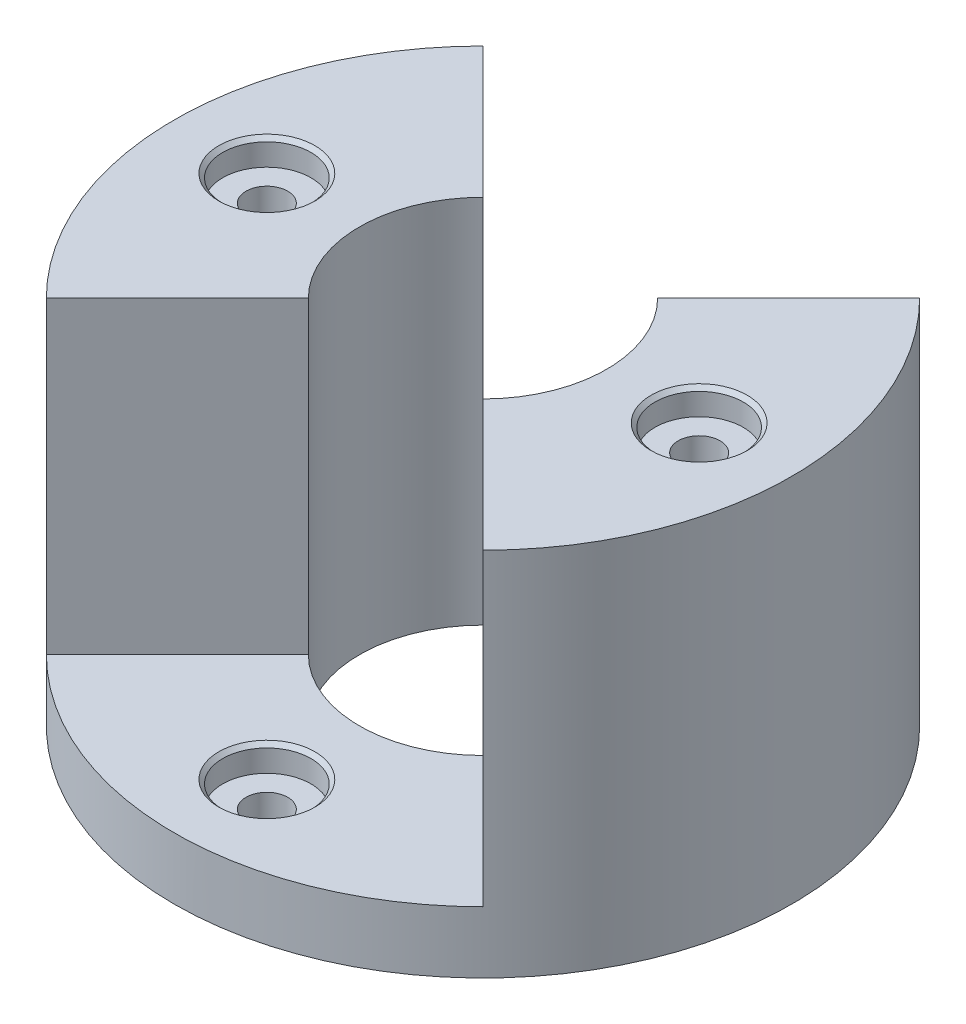
ISO-10303-21;
HEADER;
FILE_DESCRIPTION(('STEP AP214'),'2;1');
FILE_NAME('part.step','',(''),(''),'','','');
FILE_SCHEMA(('AUTOMOTIVE_DESIGN { 1 0 10303 214 1 1 1 1 }'));
ENDSEC;
DATA;
#1=APPLICATION_CONTEXT('core data for automotive mechanical design processes');
#2=APPLICATION_PROTOCOL_DEFINITION('international standard','automotive_design',2000,#1);
#3=PRODUCT_CONTEXT('',#1,'mechanical');
#4=PRODUCT('Part','Part','',(#3));
#5=PRODUCT_RELATED_PRODUCT_CATEGORY('part','',(#4));
#6=PRODUCT_DEFINITION_FORMATION('','',#4);
#7=PRODUCT_DEFINITION_CONTEXT('part definition',#1,'design');
#8=PRODUCT_DEFINITION('design','',#6,#7);
#9=PRODUCT_DEFINITION_SHAPE('','',#8);
#10=(LENGTH_UNIT() NAMED_UNIT(*) SI_UNIT(.MILLI.,.METRE.));
#11=(NAMED_UNIT(*) PLANE_ANGLE_UNIT() SI_UNIT($,.RADIAN.));
#12=(NAMED_UNIT(*) SI_UNIT($,.STERADIAN.) SOLID_ANGLE_UNIT());
#13=UNCERTAINTY_MEASURE_WITH_UNIT(LENGTH_MEASURE(1.E-05),#10,'distance_accuracy_value','');
#14=(GEOMETRIC_REPRESENTATION_CONTEXT(3) GLOBAL_UNCERTAINTY_ASSIGNED_CONTEXT((#13)) GLOBAL_UNIT_ASSIGNED_CONTEXT((#10,
#11,#12)) REPRESENTATION_CONTEXT('',''));
#15=CARTESIAN_POINT('',(0.,0.,0.));
#16=DIRECTION('',(0.,0.,1.));
#17=DIRECTION('',(1.,0.,0.));
#18=AXIS2_PLACEMENT_3D('',#15,#16,#17);
#19=CARTESIAN_POINT('',(0.,10.,0.));
#20=DIRECTION('',(0.,1.,0.));
#21=DIRECTION('',(0.,0.,1.));
#22=AXIS2_PLACEMENT_3D('',#19,#20,#21);
#23=PLANE('',#22);
#24=CARTESIAN_POINT('',(0.,10.,-35.));
#25=DIRECTION('',(0.,1.,0.));
#26=DIRECTION('',(0.,0.,1.));
#27=AXIS2_PLACEMENT_3D('',#24,#25,#26);
#28=CIRCLE('',#27,7.780000061);
#29=CARTESIAN_POINT('',(0.,10.,-27.219999939));
#30=VERTEX_POINT('',#29);
#31=EDGE_CURVE('E264',#30,#30,#28,.T.);
#32=ORIENTED_EDGE('',*,*,#31,.F.);
#33=EDGE_LOOP('',(#32));
#34=FACE_BOUND('',#33,.T.);
#35=CARTESIAN_POINT('',(0.,10.,0.));
#36=DIRECTION('',(0.,1.,0.));
#37=DIRECTION('',(0.,0.,1.));
#38=AXIS2_PLACEMENT_3D('',#35,#36,#37);
#39=CIRCLE('',#38,20.);
#40=CARTESIAN_POINT('',(14.1421356237309,10.,-14.142135623731));
#41=VERTEX_POINT('',#40);
#42=CARTESIAN_POINT('',(-14.1421356237309,10.,-14.142135623731));
#43=VERTEX_POINT('',#42);
#44=EDGE_CURVE('E59',#41,#43,#39,.T.);
#45=ORIENTED_EDGE('',*,*,#44,.F.);
#46=DIRECTION('',(0.707106781186546,0.,-0.707106781186549));
#47=VECTOR('',#46,1.);
#48=CARTESIAN_POINT('',(0.,10.,0.));
#49=LINE('',#48,#47);
#50=CARTESIAN_POINT('',(35.3553390593273,10.,-35.3553390593274));
#51=VERTEX_POINT('',#50);
#52=EDGE_CURVE('E128',#41,#51,#49,.T.);
#53=ORIENTED_EDGE('',*,*,#52,.T.);
#54=CARTESIAN_POINT('',(0.,10.,0.));
#55=DIRECTION('',(0.,1.,0.));
#56=DIRECTION('',(0.,0.,1.));
#57=AXIS2_PLACEMENT_3D('',#54,#55,#56);
#58=CIRCLE('',#57,50.);
#59=CARTESIAN_POINT('',(-35.3553390593273,10.,-35.3553390593274));
#60=VERTEX_POINT('',#59);
#61=EDGE_CURVE('E44',#51,#60,#58,.T.);
#62=ORIENTED_EDGE('',*,*,#61,.T.);
#63=DIRECTION('',(0.707106781186547,0.,0.707106781186549));
#64=VECTOR('',#63,1.);
#65=CARTESIAN_POINT('',(0.,10.,0.));
#66=LINE('',#65,#64);
#67=EDGE_CURVE('E152',#60,#43,#66,.T.);
#68=ORIENTED_EDGE('',*,*,#67,.T.);
#69=EDGE_LOOP('',(#45,#53,#62,#68));
#70=FACE_BOUND('',#69,.T.);
#71=ADVANCED_FACE('F35',(#34,#70),#23,.T.);
#72=CARTESIAN_POINT('',(0.,10.,35.));
#73=DIRECTION('',(0.,1.,0.));
#74=DIRECTION('',(0.,0.,1.));
#75=AXIS2_PLACEMENT_3D('',#72,#73,#74);
#76=CIRCLE('',#75,7.780000061);
#77=CARTESIAN_POINT('',(0.,10.,42.780000061));
#78=VERTEX_POINT('',#77);
#79=EDGE_CURVE('E277',#78,#78,#76,.T.);
#80=ORIENTED_EDGE('',*,*,#79,.F.);
#81=EDGE_LOOP('',(#80));
#82=FACE_BOUND('',#81,.T.);
#83=CARTESIAN_POINT('',(-35.3553390593273,10.,35.3553390593275));
#84=VERTEX_POINT('',#83);
#85=CARTESIAN_POINT('',(35.3553390593273,10.,35.3553390593274));
#86=VERTEX_POINT('',#85);
#87=EDGE_CURVE('E11',#84,#86,#58,.T.);
#88=ORIENTED_EDGE('',*,*,#87,.T.);
#89=DIRECTION('',(-0.707106781186547,0.,-0.707106781186549));
#90=VECTOR('',#89,1.);
#91=CARTESIAN_POINT('',(0.,10.,0.));
#92=LINE('',#91,#90);
#93=CARTESIAN_POINT('',(14.1421356237309,10.,14.142135623731));
#94=VERTEX_POINT('',#93);
#95=EDGE_CURVE('E126',#86,#94,#92,.T.);
#96=ORIENTED_EDGE('',*,*,#95,.T.);
#97=CARTESIAN_POINT('',(-14.1421356237309,10.,14.142135623731));
#98=VERTEX_POINT('',#97);
#99=EDGE_CURVE('E159',#98,#94,#39,.T.);
#100=ORIENTED_EDGE('',*,*,#99,.F.);
#101=DIRECTION('',(-0.707106781186546,0.,0.707106781186549));
#102=VECTOR('',#101,1.);
#103=CARTESIAN_POINT('',(0.,10.,0.));
#104=LINE('',#103,#102);
#105=EDGE_CURVE('E155',#98,#84,#104,.T.);
#106=ORIENTED_EDGE('',*,*,#105,.T.);
#107=EDGE_LOOP('',(#88,#96,#100,#106));
#108=FACE_BOUND('',#107,.T.);
#109=ADVANCED_FACE('F180',(#82,#108),#23,.T.);
#110=CARTESIAN_POINT('',(0.,0.,0.));
#111=DIRECTION('',(0.,1.,0.));
#112=DIRECTION('',(0.,0.,1.));
#113=AXIS2_PLACEMENT_3D('',#110,#111,#112);
#114=PLANE('',#113);
#115=CARTESIAN_POINT('',(0.,0.,35.));
#116=DIRECTION('',(0.,1.,0.));
#117=DIRECTION('',(0.,0.,1.));
#118=AXIS2_PLACEMENT_3D('',#115,#116,#117);
#119=CIRCLE('',#118,3.379999971);
#120=CARTESIAN_POINT('',(0.,0.,38.379999971));
#121=VERTEX_POINT('',#120);
#122=EDGE_CURVE('E195',#121,#121,#119,.T.);
#123=ORIENTED_EDGE('',*,*,#122,.T.);
#124=EDGE_LOOP('',(#123));
#125=FACE_BOUND('',#124,.T.);
#126=CARTESIAN_POINT('',(0.,0.,-35.));
#127=DIRECTION('',(0.,1.,0.));
#128=DIRECTION('',(0.,0.,1.));
#129=AXIS2_PLACEMENT_3D('',#126,#127,#128);
#130=CIRCLE('',#129,3.379999971);
#131=CARTESIAN_POINT('',(0.,0.,-31.620000029));
#132=VERTEX_POINT('',#131);
#133=EDGE_CURVE('E199',#132,#132,#130,.T.);
#134=ORIENTED_EDGE('',*,*,#133,.T.);
#135=EDGE_LOOP('',(#134));
#136=FACE_BOUND('',#135,.T.);
#137=CARTESIAN_POINT('',(-35.,0.,0.));
#138=DIRECTION('',(0.,1.,0.));
#139=DIRECTION('',(0.,0.,1.));
#140=AXIS2_PLACEMENT_3D('',#137,#138,#139);
#141=CIRCLE('',#140,3.37999997099998);
#142=CARTESIAN_POINT('',(-35.,0.,3.37999997099998));
#143=VERTEX_POINT('',#142);
#144=EDGE_CURVE('E203',#143,#143,#141,.T.);
#145=ORIENTED_EDGE('',*,*,#144,.T.);
#146=EDGE_LOOP('',(#145));
#147=FACE_BOUND('',#146,.T.);
#148=CARTESIAN_POINT('',(35.,0.,0.));
#149=DIRECTION('',(0.,1.,0.));
#150=DIRECTION('',(0.,0.,1.));
#151=AXIS2_PLACEMENT_3D('',#148,#149,#150);
#152=CIRCLE('',#151,3.37999997099998);
#153=CARTESIAN_POINT('',(35.,0.,3.37999997099998));
#154=VERTEX_POINT('',#153);
#155=EDGE_CURVE('E121',#154,#154,#152,.T.);
#156=ORIENTED_EDGE('',*,*,#155,.T.);
#157=EDGE_LOOP('',(#156));
#158=FACE_BOUND('',#157,.T.);
#159=CARTESIAN_POINT('',(0.,0.,0.));
#160=DIRECTION('',(0.,1.,0.));
#161=DIRECTION('',(0.,0.,1.));
#162=AXIS2_PLACEMENT_3D('',#159,#160,#161);
#163=CIRCLE('',#162,50.);
#164=CARTESIAN_POINT('',(0.,0.,50.));
#165=VERTEX_POINT('',#164);
#166=EDGE_CURVE('E39',#165,#165,#163,.T.);
#167=ORIENTED_EDGE('',*,*,#166,.F.);
#168=EDGE_LOOP('',(#167));
#169=FACE_BOUND('',#168,.T.);
#170=CARTESIAN_POINT('',(0.,0.,0.));
#171=DIRECTION('',(0.,1.,0.));
#172=DIRECTION('',(0.,0.,1.));
#173=AXIS2_PLACEMENT_3D('',#170,#171,#172);
#174=CIRCLE('',#173,20.);
#175=CARTESIAN_POINT('',(0.,0.,20.));
#176=VERTEX_POINT('',#175);
#177=EDGE_CURVE('E158',#176,#176,#174,.T.);
#178=ORIENTED_EDGE('',*,*,#177,.T.);
#179=EDGE_LOOP('',(#178));
#180=FACE_BOUND('',#179,.T.);
#181=ADVANCED_FACE('F165',(#125,#136,#147,#158,#169,#180),#114,.F.);
#182=CARTESIAN_POINT('',(0.,10.,0.));
#183=DIRECTION('',(0.,-1.,0.));
#184=DIRECTION('',(0.,0.,-1.));
#185=AXIS2_PLACEMENT_3D('',#182,#183,#184);
#186=CYLINDRICAL_SURFACE('',#185,50.);
#187=ORIENTED_EDGE('',*,*,#61,.F.);
#188=DIRECTION('',(0.,-1.,0.));
#189=VECTOR('',#188,1.);
#190=CARTESIAN_POINT('',(35.3553390593273,60.,-35.3553390593274));
#191=LINE('',#190,#189);
#192=CARTESIAN_POINT('',(35.3553390593273,60.,-35.3553390593274));
#193=VERTEX_POINT('',#192);
#194=EDGE_CURVE('E107',#193,#51,#191,.T.);
#195=ORIENTED_EDGE('',*,*,#194,.F.);
#196=CARTESIAN_POINT('',(0.,60.,0.));
#197=DIRECTION('',(0.,1.,0.));
#198=DIRECTION('',(0.,0.,1.));
#199=AXIS2_PLACEMENT_3D('',#196,#197,#198);
#200=CIRCLE('',#199,50.);
#201=CARTESIAN_POINT('',(35.3553390593273,60.,35.3553390593274));
#202=VERTEX_POINT('',#201);
#203=EDGE_CURVE('E113',#202,#193,#200,.T.);
#204=ORIENTED_EDGE('',*,*,#203,.F.);
#205=DIRECTION('',(0.,-1.,0.));
#206=VECTOR('',#205,1.);
#207=CARTESIAN_POINT('',(35.3553390593273,60.,35.3553390593274));
#208=LINE('',#207,#206);
#209=EDGE_CURVE('E223',#202,#86,#208,.T.);
#210=ORIENTED_EDGE('',*,*,#209,.T.);
#211=ORIENTED_EDGE('',*,*,#87,.F.);
#212=DIRECTION('',(0.,-1.,0.));
#213=VECTOR('',#212,1.);
#214=CARTESIAN_POINT('',(-35.3553390593273,60.,35.3553390593275));
#215=LINE('',#214,#213);
#216=CARTESIAN_POINT('',(-35.3553390593273,60.,35.3553390593275));
#217=VERTEX_POINT('',#216);
#218=EDGE_CURVE('E150',#217,#84,#215,.T.);
#219=ORIENTED_EDGE('',*,*,#218,.F.);
#220=CARTESIAN_POINT('',(0.,60.,0.));
#221=DIRECTION('',(0.,1.,0.));
#222=DIRECTION('',(0.,0.,1.));
#223=AXIS2_PLACEMENT_3D('',#220,#221,#222);
#224=CIRCLE('',#223,50.);
#225=CARTESIAN_POINT('',(-35.3553390593273,60.,-35.3553390593274));
#226=VERTEX_POINT('',#225);
#227=EDGE_CURVE('E134',#226,#217,#224,.T.);
#228=ORIENTED_EDGE('',*,*,#227,.F.);
#229=DIRECTION('',(0.,-1.,0.));
#230=VECTOR('',#229,1.);
#231=CARTESIAN_POINT('',(-35.3553390593273,60.,-35.3553390593274));
#232=LINE('',#231,#230);
#233=EDGE_CURVE('E143',#226,#60,#232,.T.);
#234=ORIENTED_EDGE('',*,*,#233,.T.);
#235=EDGE_LOOP('',(#187,#195,#204,#210,#211,#219,#228,#234));
#236=FACE_BOUND('',#235,.T.);
#237=ORIENTED_EDGE('',*,*,#166,.T.);
#238=EDGE_LOOP('',(#237));
#239=FACE_BOUND('',#238,.T.);
#240=ADVANCED_FACE('F37',(#236,#239),#186,.T.);
#241=CARTESIAN_POINT('',(0.,10.,0.));
#242=DIRECTION('',(0.,-1.,0.));
#243=DIRECTION('',(0.,0.,-1.));
#244=AXIS2_PLACEMENT_3D('',#241,#242,#243);
#245=CYLINDRICAL_SURFACE('',#244,20.);
#246=ORIENTED_EDGE('',*,*,#99,.T.);
#247=DIRECTION('',(0.,-1.,0.));
#248=VECTOR('',#247,1.);
#249=CARTESIAN_POINT('',(14.1421356237309,60.,14.142135623731));
#250=LINE('',#249,#248);
#251=CARTESIAN_POINT('',(14.1421356237309,60.,14.142135623731));
#252=VERTEX_POINT('',#251);
#253=EDGE_CURVE('E51',#252,#94,#250,.T.);
#254=ORIENTED_EDGE('',*,*,#253,.F.);
#255=CARTESIAN_POINT('',(0.,60.,0.));
#256=DIRECTION('',(0.,-1.,0.));
#257=DIRECTION('',(0.,0.,1.));
#258=AXIS2_PLACEMENT_3D('',#255,#256,#257);
#259=CIRCLE('',#258,20.);
#260=CARTESIAN_POINT('',(14.1421356237309,60.,-14.142135623731));
#261=VERTEX_POINT('',#260);
#262=EDGE_CURVE('E112',#261,#252,#259,.T.);
#263=ORIENTED_EDGE('',*,*,#262,.F.);
#264=DIRECTION('',(0.,-1.,0.));
#265=VECTOR('',#264,1.);
#266=CARTESIAN_POINT('',(14.1421356237309,60.,-14.142135623731));
#267=LINE('',#266,#265);
#268=EDGE_CURVE('E109',#261,#41,#267,.T.);
#269=ORIENTED_EDGE('',*,*,#268,.T.);
#270=ORIENTED_EDGE('',*,*,#44,.T.);
#271=DIRECTION('',(0.,-1.,0.));
#272=VECTOR('',#271,1.);
#273=CARTESIAN_POINT('',(-14.1421356237309,60.,-14.142135623731));
#274=LINE('',#273,#272);
#275=CARTESIAN_POINT('',(-14.1421356237309,60.,-14.142135623731));
#276=VERTEX_POINT('',#275);
#277=EDGE_CURVE('E145',#276,#43,#274,.T.);
#278=ORIENTED_EDGE('',*,*,#277,.F.);
#279=CARTESIAN_POINT('',(0.,60.,0.));
#280=DIRECTION('',(0.,-1.,0.));
#281=DIRECTION('',(0.,0.,1.));
#282=AXIS2_PLACEMENT_3D('',#279,#280,#281);
#283=CIRCLE('',#282,20.);
#284=CARTESIAN_POINT('',(-14.1421356237309,60.,14.142135623731));
#285=VERTEX_POINT('',#284);
#286=EDGE_CURVE('E139',#285,#276,#283,.T.);
#287=ORIENTED_EDGE('',*,*,#286,.F.);
#288=DIRECTION('',(0.,-1.,0.));
#289=VECTOR('',#288,1.);
#290=CARTESIAN_POINT('',(-14.1421356237309,60.,14.142135623731));
#291=LINE('',#290,#289);
#292=EDGE_CURVE('E147',#285,#98,#291,.T.);
#293=ORIENTED_EDGE('',*,*,#292,.T.);
#294=EDGE_LOOP('',(#246,#254,#263,#269,#270,#278,#287,#293));
#295=FACE_BOUND('',#294,.T.);
#296=ORIENTED_EDGE('',*,*,#177,.F.);
#297=EDGE_LOOP('',(#296));
#298=FACE_BOUND('',#297,.T.);
#299=ADVANCED_FACE('F167',(#295,#298),#245,.F.);
#300=CARTESIAN_POINT('',(-35.3553390593273,60.,35.3553390593275));
#301=DIRECTION('',(-0.707106781186549,0.,-0.707106781186546));
#302=DIRECTION('',(-0.707106781186546,0.,0.707106781186549));
#303=AXIS2_PLACEMENT_3D('',#300,#301,#302);
#304=PLANE('',#303);
#305=ORIENTED_EDGE('',*,*,#105,.F.);
#306=ORIENTED_EDGE('',*,*,#292,.F.);
#307=DIRECTION('',(0.707106781186546,0.,-0.707106781186549));
#308=VECTOR('',#307,1.);
#309=CARTESIAN_POINT('',(-35.3553390593273,60.,35.3553390593275));
#310=LINE('',#309,#308);
#311=EDGE_CURVE('E137',#217,#285,#310,.T.);
#312=ORIENTED_EDGE('',*,*,#311,.F.);
#313=ORIENTED_EDGE('',*,*,#218,.T.);
#314=EDGE_LOOP('',(#305,#306,#312,#313));
#315=FACE_BOUND('',#314,.T.);
#316=ADVANCED_FACE('F169',(#315),#304,.F.);
#317=CARTESIAN_POINT('',(-35.3553390593273,60.,-35.3553390593274));
#318=DIRECTION('',(-0.707106781186549,0.,0.707106781186547));
#319=DIRECTION('',(0.707106781186547,0.,0.707106781186549));
#320=AXIS2_PLACEMENT_3D('',#317,#318,#319);
#321=PLANE('',#320);
#322=ORIENTED_EDGE('',*,*,#67,.F.);
#323=ORIENTED_EDGE('',*,*,#233,.F.);
#324=DIRECTION('',(-0.707106781186547,0.,-0.707106781186549));
#325=VECTOR('',#324,1.);
#326=CARTESIAN_POINT('',(-35.3553390593273,60.,-35.3553390593274));
#327=LINE('',#326,#325);
#328=EDGE_CURVE('E141',#276,#226,#327,.T.);
#329=ORIENTED_EDGE('',*,*,#328,.F.);
#330=ORIENTED_EDGE('',*,*,#277,.T.);
#331=EDGE_LOOP('',(#322,#323,#329,#330));
#332=FACE_BOUND('',#331,.T.);
#333=ADVANCED_FACE('F175',(#332),#321,.F.);
#334=CARTESIAN_POINT('',(0.,60.,0.));
#335=DIRECTION('',(0.,1.,0.));
#336=DIRECTION('',(0.,0.,1.));
#337=AXIS2_PLACEMENT_3D('',#334,#335,#336);
#338=PLANE('',#337);
#339=CARTESIAN_POINT('',(-35.,60.,0.));
#340=DIRECTION('',(0.,1.,0.));
#341=DIRECTION('',(0.,0.,1.));
#342=AXIS2_PLACEMENT_3D('',#339,#340,#341);
#343=CIRCLE('',#342,7.780000061);
#344=CARTESIAN_POINT('',(-35.,60.,7.780000061));
#345=VERTEX_POINT('',#344);
#346=EDGE_CURVE('E251',#345,#345,#343,.T.);
#347=ORIENTED_EDGE('',*,*,#346,.F.);
#348=EDGE_LOOP('',(#347));
#349=FACE_BOUND('',#348,.T.);
#350=ORIENTED_EDGE('',*,*,#227,.T.);
#351=ORIENTED_EDGE('',*,*,#311,.T.);
#352=ORIENTED_EDGE('',*,*,#286,.T.);
#353=ORIENTED_EDGE('',*,*,#328,.T.);
#354=EDGE_LOOP('',(#350,#351,#352,#353));
#355=FACE_BOUND('',#354,.T.);
#356=ADVANCED_FACE('F217',(#349,#355),#338,.T.);
#357=CARTESIAN_POINT('',(14.1421356237309,60.,-14.142135623731));
#358=DIRECTION('',(0.707106781186549,0.,0.707106781186546));
#359=DIRECTION('',(0.707106781186546,0.,-0.707106781186549));
#360=AXIS2_PLACEMENT_3D('',#357,#358,#359);
#361=PLANE('',#360);
#362=ORIENTED_EDGE('',*,*,#52,.F.);
#363=ORIENTED_EDGE('',*,*,#268,.F.);
#364=DIRECTION('',(-0.707106781186546,0.,0.707106781186549));
#365=VECTOR('',#364,1.);
#366=CARTESIAN_POINT('',(14.1421356237309,60.,-14.142135623731));
#367=LINE('',#366,#365);
#368=EDGE_CURVE('E103',#193,#261,#367,.T.);
#369=ORIENTED_EDGE('',*,*,#368,.F.);
#370=ORIENTED_EDGE('',*,*,#194,.T.);
#371=EDGE_LOOP('',(#362,#363,#369,#370));
#372=FACE_BOUND('',#371,.T.);
#373=ADVANCED_FACE('F105',(#372),#361,.F.);
#374=CARTESIAN_POINT('',(14.1421356237309,60.,14.142135623731));
#375=DIRECTION('',(0.707106781186549,0.,-0.707106781186547));
#376=DIRECTION('',(-0.707106781186547,0.,-0.707106781186549));
#377=AXIS2_PLACEMENT_3D('',#374,#375,#376);
#378=PLANE('',#377);
#379=ORIENTED_EDGE('',*,*,#95,.F.);
#380=ORIENTED_EDGE('',*,*,#209,.F.);
#381=DIRECTION('',(0.707106781186547,0.,0.707106781186548));
#382=VECTOR('',#381,1.);
#383=CARTESIAN_POINT('',(14.1421356237309,60.,14.142135623731));
#384=LINE('',#383,#382);
#385=EDGE_CURVE('E117',#252,#202,#384,.T.);
#386=ORIENTED_EDGE('',*,*,#385,.F.);
#387=ORIENTED_EDGE('',*,*,#253,.T.);
#388=EDGE_LOOP('',(#379,#380,#386,#387));
#389=FACE_BOUND('',#388,.T.);
#390=ADVANCED_FACE('F222',(#389),#378,.F.);
#391=CARTESIAN_POINT('',(0.,60.,0.));
#392=DIRECTION('',(0.,1.,0.));
#393=DIRECTION('',(0.,0.,1.));
#394=AXIS2_PLACEMENT_3D('',#391,#392,#393);
#395=PLANE('',#394);
#396=CARTESIAN_POINT('',(35.,60.,0.));
#397=DIRECTION('',(0.,1.,0.));
#398=DIRECTION('',(0.,0.,1.));
#399=AXIS2_PLACEMENT_3D('',#396,#397,#398);
#400=CIRCLE('',#399,7.780000061);
#401=CARTESIAN_POINT('',(35.,60.,7.780000061));
#402=VERTEX_POINT('',#401);
#403=EDGE_CURVE('E238',#402,#402,#400,.T.);
#404=ORIENTED_EDGE('',*,*,#403,.F.);
#405=EDGE_LOOP('',(#404));
#406=FACE_BOUND('',#405,.T.);
#407=ORIENTED_EDGE('',*,*,#203,.T.);
#408=ORIENTED_EDGE('',*,*,#368,.T.);
#409=ORIENTED_EDGE('',*,*,#262,.T.);
#410=ORIENTED_EDGE('',*,*,#385,.T.);
#411=EDGE_LOOP('',(#407,#408,#409,#410));
#412=FACE_BOUND('',#411,.T.);
#413=ADVANCED_FACE('F116',(#406,#412),#395,.T.);
#414=CARTESIAN_POINT('',(35.,60.,0.));
#415=DIRECTION('',(0.,1.,0.));
#416=DIRECTION('',(0.,0.,1.));
#417=AXIS2_PLACEMENT_3D('',#414,#415,#416);
#418=CYLINDRICAL_SURFACE('',#417,3.379999971);
#419=ORIENTED_EDGE('',*,*,#155,.F.);
#420=EDGE_LOOP('',(#419));
#421=FACE_BOUND('',#420,.T.);
#422=CARTESIAN_POINT('',(35.,55.809999998,0.));
#423=DIRECTION('',(0.,1.,0.));
#424=DIRECTION('',(0.,0.,1.));
#425=AXIS2_PLACEMENT_3D('',#422,#423,#424);
#426=CIRCLE('',#425,3.37999997100001);
#427=CARTESIAN_POINT('',(35.,55.809999998,3.37999997100001));
#428=VERTEX_POINT('',#427);
#429=EDGE_CURVE('E229',#428,#428,#426,.T.);
#430=ORIENTED_EDGE('',*,*,#429,.T.);
#431=EDGE_LOOP('',(#430));
#432=FACE_BOUND('',#431,.T.);
#433=ADVANCED_FACE('F344',(#421,#432),#418,.F.);
#434=CARTESIAN_POINT('',(42.145000061,55.809999998,0.));
#435=DIRECTION('',(0.,-1.,0.));
#436=DIRECTION('',(0.,0.,-1.));
#437=AXIS2_PLACEMENT_3D('',#434,#435,#436);
#438=PLANE('',#437);
#439=ORIENTED_EDGE('',*,*,#429,.F.);
#440=EDGE_LOOP('',(#439));
#441=FACE_BOUND('',#440,.T.);
#442=CARTESIAN_POINT('',(35.,55.809999998,0.));
#443=DIRECTION('',(0.,1.,0.));
#444=DIRECTION('',(0.,0.,1.));
#445=AXIS2_PLACEMENT_3D('',#442,#443,#444);
#446=CIRCLE('',#445,7.145000061);
#447=CARTESIAN_POINT('',(35.,55.809999998,7.145000061));
#448=VERTEX_POINT('',#447);
#449=EDGE_CURVE('E232',#448,#448,#446,.T.);
#450=ORIENTED_EDGE('',*,*,#449,.T.);
#451=EDGE_LOOP('',(#450));
#452=FACE_BOUND('',#451,.T.);
#453=ADVANCED_FACE('F340',(#441,#452),#438,.F.);
#454=CARTESIAN_POINT('',(35.,60.,0.));
#455=DIRECTION('',(0.,1.,0.));
#456=DIRECTION('',(0.,0.,1.));
#457=AXIS2_PLACEMENT_3D('',#454,#455,#456);
#458=CYLINDRICAL_SURFACE('',#457,7.145000061);
#459=ORIENTED_EDGE('',*,*,#449,.F.);
#460=EDGE_LOOP('',(#459));
#461=FACE_BOUND('',#460,.T.);
#462=CARTESIAN_POINT('',(35.,59.365,0.));
#463=DIRECTION('',(0.,1.,0.));
#464=DIRECTION('',(0.,0.,1.));
#465=AXIS2_PLACEMENT_3D('',#462,#463,#464);
#466=CIRCLE('',#465,7.145000061);
#467=CARTESIAN_POINT('',(35.,59.365,7.145000061));
#468=VERTEX_POINT('',#467);
#469=EDGE_CURVE('E235',#468,#468,#466,.T.);
#470=ORIENTED_EDGE('',*,*,#469,.T.);
#471=EDGE_LOOP('',(#470));
#472=FACE_BOUND('',#471,.T.);
#473=ADVANCED_FACE('F336',(#461,#472),#458,.F.);
#474=CARTESIAN_POINT('',(35.,60.,0.));
#475=DIRECTION('',(0.,1.,0.));
#476=DIRECTION('',(0.,0.,1.));
#477=AXIS2_PLACEMENT_3D('',#474,#475,#476);
#478=CONICAL_SURFACE('',#477,7.780000061,0.785398163397454);
#479=ORIENTED_EDGE('',*,*,#469,.F.);
#480=EDGE_LOOP('',(#479));
#481=FACE_BOUND('',#480,.T.);
#482=ORIENTED_EDGE('',*,*,#403,.T.);
#483=EDGE_LOOP('',(#482));
#484=FACE_BOUND('',#483,.T.);
#485=ADVANCED_FACE('F332',(#481,#484),#478,.F.);
#486=CARTESIAN_POINT('',(-35.,60.,0.));
#487=DIRECTION('',(0.,1.,0.));
#488=DIRECTION('',(0.,0.,1.));
#489=AXIS2_PLACEMENT_3D('',#486,#487,#488);
#490=CYLINDRICAL_SURFACE('',#489,3.379999971);
#491=ORIENTED_EDGE('',*,*,#144,.F.);
#492=EDGE_LOOP('',(#491));
#493=FACE_BOUND('',#492,.T.);
#494=CARTESIAN_POINT('',(-35.,55.809999998,0.));
#495=DIRECTION('',(0.,1.,0.));
#496=DIRECTION('',(0.,0.,1.));
#497=AXIS2_PLACEMENT_3D('',#494,#495,#496);
#498=CIRCLE('',#497,3.37999997100001);
#499=CARTESIAN_POINT('',(-35.,55.809999998,3.37999997100001));
#500=VERTEX_POINT('',#499);
#501=EDGE_CURVE('E242',#500,#500,#498,.T.);
#502=ORIENTED_EDGE('',*,*,#501,.T.);
#503=EDGE_LOOP('',(#502));
#504=FACE_BOUND('',#503,.T.);
#505=ADVANCED_FACE('F328',(#493,#504),#490,.F.);
#506=CARTESIAN_POINT('',(-27.854999939,55.809999998,0.));
#507=DIRECTION('',(0.,-1.,0.));
#508=DIRECTION('',(0.,0.,-1.));
#509=AXIS2_PLACEMENT_3D('',#506,#507,#508);
#510=PLANE('',#509);
#511=ORIENTED_EDGE('',*,*,#501,.F.);
#512=EDGE_LOOP('',(#511));
#513=FACE_BOUND('',#512,.T.);
#514=CARTESIAN_POINT('',(-35.,55.809999998,0.));
#515=DIRECTION('',(0.,1.,0.));
#516=DIRECTION('',(0.,0.,1.));
#517=AXIS2_PLACEMENT_3D('',#514,#515,#516);
#518=CIRCLE('',#517,7.145000061);
#519=CARTESIAN_POINT('',(-35.,55.809999998,7.145000061));
#520=VERTEX_POINT('',#519);
#521=EDGE_CURVE('E245',#520,#520,#518,.T.);
#522=ORIENTED_EDGE('',*,*,#521,.T.);
#523=EDGE_LOOP('',(#522));
#524=FACE_BOUND('',#523,.T.);
#525=ADVANCED_FACE('F324',(#513,#524),#510,.F.);
#526=CARTESIAN_POINT('',(-35.,60.,0.));
#527=DIRECTION('',(0.,1.,0.));
#528=DIRECTION('',(0.,0.,1.));
#529=AXIS2_PLACEMENT_3D('',#526,#527,#528);
#530=CYLINDRICAL_SURFACE('',#529,7.145000061);
#531=ORIENTED_EDGE('',*,*,#521,.F.);
#532=EDGE_LOOP('',(#531));
#533=FACE_BOUND('',#532,.T.);
#534=CARTESIAN_POINT('',(-35.,59.365,0.));
#535=DIRECTION('',(0.,1.,0.));
#536=DIRECTION('',(0.,0.,1.));
#537=AXIS2_PLACEMENT_3D('',#534,#535,#536);
#538=CIRCLE('',#537,7.145000061);
#539=CARTESIAN_POINT('',(-35.,59.365,7.145000061));
#540=VERTEX_POINT('',#539);
#541=EDGE_CURVE('E248',#540,#540,#538,.T.);
#542=ORIENTED_EDGE('',*,*,#541,.T.);
#543=EDGE_LOOP('',(#542));
#544=FACE_BOUND('',#543,.T.);
#545=ADVANCED_FACE('F320',(#533,#544),#530,.F.);
#546=CARTESIAN_POINT('',(-35.,60.,0.));
#547=DIRECTION('',(0.,1.,0.));
#548=DIRECTION('',(0.,0.,1.));
#549=AXIS2_PLACEMENT_3D('',#546,#547,#548);
#550=CONICAL_SURFACE('',#549,7.780000061,0.785398163397451);
#551=ORIENTED_EDGE('',*,*,#541,.F.);
#552=EDGE_LOOP('',(#551));
#553=FACE_BOUND('',#552,.T.);
#554=ORIENTED_EDGE('',*,*,#346,.T.);
#555=EDGE_LOOP('',(#554));
#556=FACE_BOUND('',#555,.T.);
#557=ADVANCED_FACE('F316',(#553,#556),#550,.F.);
#558=CARTESIAN_POINT('',(0.,10.,-35.));
#559=DIRECTION('',(0.,1.,0.));
#560=DIRECTION('',(0.,0.,1.));
#561=AXIS2_PLACEMENT_3D('',#558,#559,#560);
#562=CYLINDRICAL_SURFACE('',#561,3.379999971);
#563=ORIENTED_EDGE('',*,*,#133,.F.);
#564=EDGE_LOOP('',(#563));
#565=FACE_BOUND('',#564,.T.);
#566=CARTESIAN_POINT('',(0.,5.80999999800001,-35.));
#567=DIRECTION('',(0.,1.,0.));
#568=DIRECTION('',(0.,0.,1.));
#569=AXIS2_PLACEMENT_3D('',#566,#567,#568);
#570=CIRCLE('',#569,3.37999997100001);
#571=CARTESIAN_POINT('',(0.,5.80999999800001,-31.620000029));
#572=VERTEX_POINT('',#571);
#573=EDGE_CURVE('E255',#572,#572,#570,.T.);
#574=ORIENTED_EDGE('',*,*,#573,.T.);
#575=EDGE_LOOP('',(#574));
#576=FACE_BOUND('',#575,.T.);
#577=ADVANCED_FACE('F312',(#565,#576),#562,.F.);
#578=CARTESIAN_POINT('',(7.145000061,5.80999999800001,-35.));
#579=DIRECTION('',(0.,-1.,0.));
#580=DIRECTION('',(0.,0.,-1.));
#581=AXIS2_PLACEMENT_3D('',#578,#579,#580);
#582=PLANE('',#581);
#583=ORIENTED_EDGE('',*,*,#573,.F.);
#584=EDGE_LOOP('',(#583));
#585=FACE_BOUND('',#584,.T.);
#586=CARTESIAN_POINT('',(0.,5.80999999800001,-35.));
#587=DIRECTION('',(0.,1.,0.));
#588=DIRECTION('',(0.,0.,1.));
#589=AXIS2_PLACEMENT_3D('',#586,#587,#588);
#590=CIRCLE('',#589,7.145000061);
#591=CARTESIAN_POINT('',(0.,5.80999999800001,-27.854999939));
#592=VERTEX_POINT('',#591);
#593=EDGE_CURVE('E258',#592,#592,#590,.T.);
#594=ORIENTED_EDGE('',*,*,#593,.T.);
#595=EDGE_LOOP('',(#594));
#596=FACE_BOUND('',#595,.T.);
#597=ADVANCED_FACE('F308',(#585,#596),#582,.F.);
#598=CARTESIAN_POINT('',(0.,10.,-35.));
#599=DIRECTION('',(0.,1.,0.));
#600=DIRECTION('',(0.,0.,1.));
#601=AXIS2_PLACEMENT_3D('',#598,#599,#600);
#602=CYLINDRICAL_SURFACE('',#601,7.145000061);
#603=ORIENTED_EDGE('',*,*,#593,.F.);
#604=EDGE_LOOP('',(#603));
#605=FACE_BOUND('',#604,.T.);
#606=CARTESIAN_POINT('',(0.,9.365,-35.));
#607=DIRECTION('',(0.,1.,0.));
#608=DIRECTION('',(0.,0.,1.));
#609=AXIS2_PLACEMENT_3D('',#606,#607,#608);
#610=CIRCLE('',#609,7.145000061);
#611=CARTESIAN_POINT('',(0.,9.365,-27.854999939));
#612=VERTEX_POINT('',#611);
#613=EDGE_CURVE('E261',#612,#612,#610,.T.);
#614=ORIENTED_EDGE('',*,*,#613,.T.);
#615=EDGE_LOOP('',(#614));
#616=FACE_BOUND('',#615,.T.);
#617=ADVANCED_FACE('F304',(#605,#616),#602,.F.);
#618=CARTESIAN_POINT('',(0.,10.,-35.));
#619=DIRECTION('',(0.,1.,0.));
#620=DIRECTION('',(0.,0.,1.));
#621=AXIS2_PLACEMENT_3D('',#618,#619,#620);
#622=CONICAL_SURFACE('',#621,7.780000061,0.78539816339745);
#623=ORIENTED_EDGE('',*,*,#613,.F.);
#624=EDGE_LOOP('',(#623));
#625=FACE_BOUND('',#624,.T.);
#626=ORIENTED_EDGE('',*,*,#31,.T.);
#627=EDGE_LOOP('',(#626));
#628=FACE_BOUND('',#627,.T.);
#629=ADVANCED_FACE('F300',(#625,#628),#622,.F.);
#630=CARTESIAN_POINT('',(0.,10.,35.));
#631=DIRECTION('',(0.,1.,0.));
#632=DIRECTION('',(0.,0.,1.));
#633=AXIS2_PLACEMENT_3D('',#630,#631,#632);
#634=CYLINDRICAL_SURFACE('',#633,3.379999971);
#635=ORIENTED_EDGE('',*,*,#122,.F.);
#636=EDGE_LOOP('',(#635));
#637=FACE_BOUND('',#636,.T.);
#638=CARTESIAN_POINT('',(0.,5.80999999800001,35.));
#639=DIRECTION('',(0.,1.,0.));
#640=DIRECTION('',(0.,0.,1.));
#641=AXIS2_PLACEMENT_3D('',#638,#639,#640);
#642=CIRCLE('',#641,3.37999997100001);
#643=CARTESIAN_POINT('',(0.,5.80999999800001,38.379999971));
#644=VERTEX_POINT('',#643);
#645=EDGE_CURVE('E268',#644,#644,#642,.T.);
#646=ORIENTED_EDGE('',*,*,#645,.T.);
#647=EDGE_LOOP('',(#646));
#648=FACE_BOUND('',#647,.T.);
#649=ADVANCED_FACE('F296',(#637,#648),#634,.F.);
#650=CARTESIAN_POINT('',(7.145000061,5.80999999800001,35.));
#651=DIRECTION('',(0.,-1.,0.));
#652=DIRECTION('',(0.,0.,-1.));
#653=AXIS2_PLACEMENT_3D('',#650,#651,#652);
#654=PLANE('',#653);
#655=ORIENTED_EDGE('',*,*,#645,.F.);
#656=EDGE_LOOP('',(#655));
#657=FACE_BOUND('',#656,.T.);
#658=CARTESIAN_POINT('',(0.,5.80999999800001,35.));
#659=DIRECTION('',(0.,1.,0.));
#660=DIRECTION('',(0.,0.,1.));
#661=AXIS2_PLACEMENT_3D('',#658,#659,#660);
#662=CIRCLE('',#661,7.145000061);
#663=CARTESIAN_POINT('',(0.,5.80999999800001,42.145000061));
#664=VERTEX_POINT('',#663);
#665=EDGE_CURVE('E271',#664,#664,#662,.T.);
#666=ORIENTED_EDGE('',*,*,#665,.T.);
#667=EDGE_LOOP('',(#666));
#668=FACE_BOUND('',#667,.T.);
#669=ADVANCED_FACE('F289',(#657,#668),#654,.F.);
#670=CARTESIAN_POINT('',(0.,10.,35.));
#671=DIRECTION('',(0.,1.,0.));
#672=DIRECTION('',(0.,0.,1.));
#673=AXIS2_PLACEMENT_3D('',#670,#671,#672);
#674=CYLINDRICAL_SURFACE('',#673,7.145000061);
#675=ORIENTED_EDGE('',*,*,#665,.F.);
#676=EDGE_LOOP('',(#675));
#677=FACE_BOUND('',#676,.T.);
#678=CARTESIAN_POINT('',(0.,9.365,35.));
#679=DIRECTION('',(0.,1.,0.));
#680=DIRECTION('',(0.,0.,1.));
#681=AXIS2_PLACEMENT_3D('',#678,#679,#680);
#682=CIRCLE('',#681,7.145000061);
#683=CARTESIAN_POINT('',(0.,9.365,42.145000061));
#684=VERTEX_POINT('',#683);
#685=EDGE_CURVE('E274',#684,#684,#682,.T.);
#686=ORIENTED_EDGE('',*,*,#685,.T.);
#687=EDGE_LOOP('',(#686));
#688=FACE_BOUND('',#687,.T.);
#689=ADVANCED_FACE('F283',(#677,#688),#674,.F.);
#690=CARTESIAN_POINT('',(0.,10.,35.));
#691=DIRECTION('',(0.,1.,0.));
#692=DIRECTION('',(0.,0.,1.));
#693=AXIS2_PLACEMENT_3D('',#690,#691,#692);
#694=CONICAL_SURFACE('',#693,7.780000061,0.78539816339745);
#695=ORIENTED_EDGE('',*,*,#685,.F.);
#696=EDGE_LOOP('',(#695));
#697=FACE_BOUND('',#696,.T.);
#698=ORIENTED_EDGE('',*,*,#79,.T.);
#699=EDGE_LOOP('',(#698));
#700=FACE_BOUND('',#699,.T.);
#701=ADVANCED_FACE('F281',(#697,#700),#694,.F.);
#702=CLOSED_SHELL('',(#71,#109,#181,#240,#299,#316,#333,#356,#373,#390,#413,#433,#453,#473,#485,
#505,#525,#545,#557,#577,#597,#617,#629,#649,#669,#689,#701));
#703=MANIFOLD_SOLID_BREP('B2',#702);
#704=ADVANCED_BREP_SHAPE_REPRESENTATION('',(#18,#703),#14);
#705=SHAPE_DEFINITION_REPRESENTATION(#9,#704);
ENDSEC;
END-ISO-10303-21;
